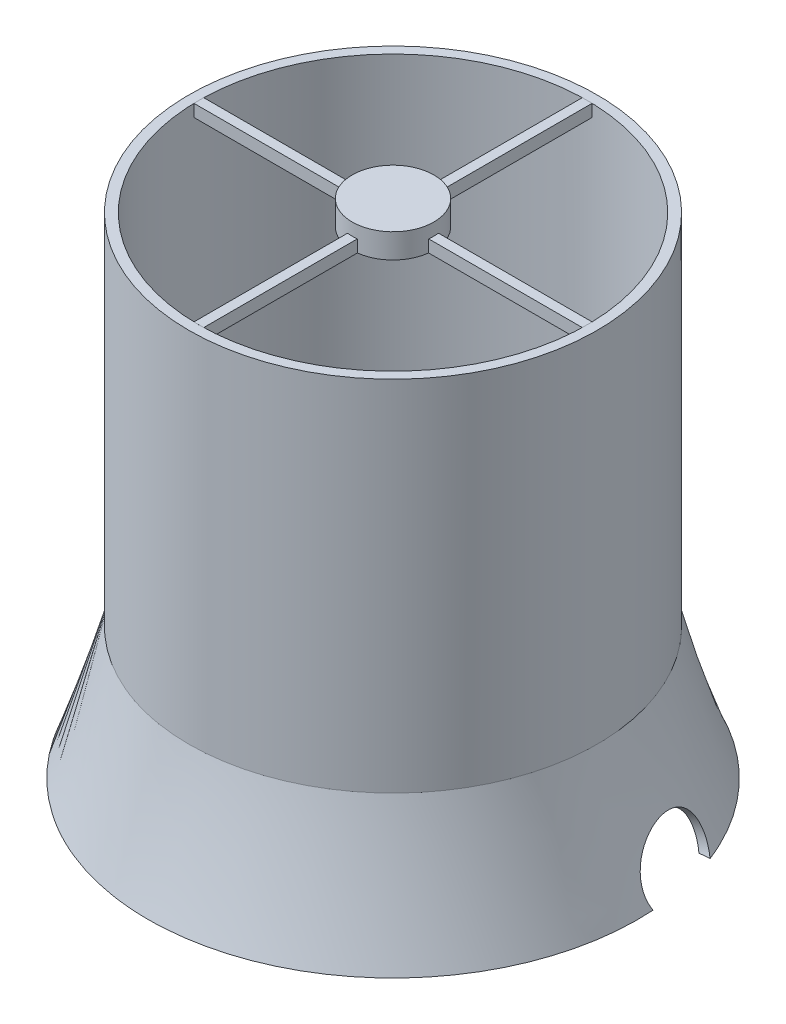
ISO-10303-21;
HEADER;
FILE_DESCRIPTION(('STEP AP214'),'2;1');
FILE_NAME('part.step','',(''),(''),'','','');
FILE_SCHEMA(('AUTOMOTIVE_DESIGN { 1 0 10303 214 1 1 1 1 }'));
ENDSEC;
DATA;
#1=APPLICATION_CONTEXT('core data for automotive mechanical design processes');
#2=APPLICATION_PROTOCOL_DEFINITION('international standard','automotive_design',2000,#1);
#3=PRODUCT_CONTEXT('',#1,'mechanical');
#4=PRODUCT('Part','Part','',(#3));
#5=PRODUCT_RELATED_PRODUCT_CATEGORY('part','',(#4));
#6=PRODUCT_DEFINITION_FORMATION('','',#4);
#7=PRODUCT_DEFINITION_CONTEXT('part definition',#1,'design');
#8=PRODUCT_DEFINITION('design','',#6,#7);
#9=PRODUCT_DEFINITION_SHAPE('','',#8);
#10=(LENGTH_UNIT() NAMED_UNIT(*) SI_UNIT(.MILLI.,.METRE.));
#11=(NAMED_UNIT(*) PLANE_ANGLE_UNIT() SI_UNIT($,.RADIAN.));
#12=(NAMED_UNIT(*) SI_UNIT($,.STERADIAN.) SOLID_ANGLE_UNIT());
#13=UNCERTAINTY_MEASURE_WITH_UNIT(LENGTH_MEASURE(1.E-05),#10,'distance_accuracy_value','');
#14=(GEOMETRIC_REPRESENTATION_CONTEXT(3) GLOBAL_UNCERTAINTY_ASSIGNED_CONTEXT((#13)) GLOBAL_UNIT_ASSIGNED_CONTEXT((#10,
#11,#12)) REPRESENTATION_CONTEXT('',''));
#15=CARTESIAN_POINT('',(0.,0.,0.));
#16=DIRECTION('',(0.,0.,1.));
#17=DIRECTION('',(1.,0.,0.));
#18=AXIS2_PLACEMENT_3D('',#15,#16,#17);
#19=CARTESIAN_POINT('',(0.,60.,0.));
#20=DIRECTION('',(0.,1.,0.));
#21=DIRECTION('',(0.,0.,1.));
#22=AXIS2_PLACEMENT_3D('',#19,#20,#21);
#23=PLANE('',#22);
#24=CARTESIAN_POINT('',(0.,60.,0.));
#25=DIRECTION('',(0.,1.,0.));
#26=DIRECTION('',(0.,0.,1.));
#27=AXIS2_PLACEMENT_3D('',#24,#25,#26);
#28=CIRCLE('',#27,5.);
#29=CARTESIAN_POINT('',(4.96386945839634,60.,0.6));
#30=VERTEX_POINT('',#29);
#31=CARTESIAN_POINT('',(4.96386945839634,60.,-0.6));
#32=VERTEX_POINT('',#31);
#33=EDGE_CURVE('E13',#30,#32,#28,.T.);
#34=ORIENTED_EDGE('',*,*,#33,.F.);
#35=DIRECTION('',(1.,0.,0.));
#36=VECTOR('',#35,1.);
#37=CARTESIAN_POINT('',(4.96386945839634,60.,0.6));
#38=LINE('',#37,#36);
#39=CARTESIAN_POINT('',(23.7924357727409,60.,0.6));
#40=VERTEX_POINT('',#39);
#41=EDGE_CURVE('E219',#30,#40,#38,.T.);
#42=ORIENTED_EDGE('',*,*,#41,.T.);
#43=DIRECTION('',(0.,0.,-1.));
#44=VECTOR('',#43,1.);
#45=CARTESIAN_POINT('',(23.7924357727409,60.,0.6));
#46=LINE('',#45,#44);
#47=CARTESIAN_POINT('',(23.7924357727409,60.,-0.6));
#48=VERTEX_POINT('',#47);
#49=EDGE_CURVE('E222',#40,#48,#46,.T.);
#50=ORIENTED_EDGE('',*,*,#49,.T.);
#51=DIRECTION('',(-1.,0.,0.));
#52=VECTOR('',#51,1.);
#53=CARTESIAN_POINT('',(23.7924357727409,60.,-0.6));
#54=LINE('',#53,#52);
#55=EDGE_CURVE('E225',#48,#32,#54,.T.);
#56=ORIENTED_EDGE('',*,*,#55,.T.);
#57=EDGE_LOOP('',(#34,#42,#50,#56));
#58=FACE_BOUND('',#57,.T.);
#59=ADVANCED_FACE('F49',(#58),#23,.T.);
#60=CARTESIAN_POINT('',(0.6,60.,-4.96386945839634));
#61=VERTEX_POINT('',#60);
#62=CARTESIAN_POINT('',(-0.6,60.,-4.96386945839634));
#63=VERTEX_POINT('',#62);
#64=EDGE_CURVE('E59',#61,#63,#28,.T.);
#65=ORIENTED_EDGE('',*,*,#64,.F.);
#66=DIRECTION('',(0.,0.,-1.));
#67=VECTOR('',#66,1.);
#68=CARTESIAN_POINT('',(0.6,60.,-4.96386945839634));
#69=LINE('',#68,#67);
#70=CARTESIAN_POINT('',(0.6,60.,-23.7924357727409));
#71=VERTEX_POINT('',#70);
#72=EDGE_CURVE('E228',#61,#71,#69,.T.);
#73=ORIENTED_EDGE('',*,*,#72,.T.);
#74=DIRECTION('',(-1.,0.,0.));
#75=VECTOR('',#74,1.);
#76=CARTESIAN_POINT('',(0.6,60.,-23.7924357727409));
#77=LINE('',#76,#75);
#78=CARTESIAN_POINT('',(-0.6,60.,-23.7924357727409));
#79=VERTEX_POINT('',#78);
#80=EDGE_CURVE('E231',#71,#79,#77,.T.);
#81=ORIENTED_EDGE('',*,*,#80,.T.);
#82=DIRECTION('',(0.,0.,1.));
#83=VECTOR('',#82,1.);
#84=CARTESIAN_POINT('',(-0.6,60.,-23.7924357727409));
#85=LINE('',#84,#83);
#86=EDGE_CURVE('E234',#79,#63,#85,.T.);
#87=ORIENTED_EDGE('',*,*,#86,.T.);
#88=EDGE_LOOP('',(#65,#73,#81,#87));
#89=FACE_BOUND('',#88,.T.);
#90=ADVANCED_FACE('F348',(#89),#23,.T.);
#91=CARTESIAN_POINT('',(-4.96386945839634,60.,-0.600000000000001));
#92=VERTEX_POINT('',#91);
#93=CARTESIAN_POINT('',(-4.96386945839634,60.,0.6));
#94=VERTEX_POINT('',#93);
#95=EDGE_CURVE('E121',#92,#94,#28,.T.);
#96=ORIENTED_EDGE('',*,*,#95,.F.);
#97=DIRECTION('',(-1.,0.,0.));
#98=VECTOR('',#97,1.);
#99=CARTESIAN_POINT('',(-4.96386945839634,60.,-0.6));
#100=LINE('',#99,#98);
#101=CARTESIAN_POINT('',(-23.7924357727409,60.,-0.6));
#102=VERTEX_POINT('',#101);
#103=EDGE_CURVE('E236',#92,#102,#100,.T.);
#104=ORIENTED_EDGE('',*,*,#103,.T.);
#105=DIRECTION('',(0.,0.,1.));
#106=VECTOR('',#105,1.);
#107=CARTESIAN_POINT('',(-23.7924357727409,60.,-0.6));
#108=LINE('',#107,#106);
#109=CARTESIAN_POINT('',(-23.7924357727409,60.,0.6));
#110=VERTEX_POINT('',#109);
#111=EDGE_CURVE('E204',#102,#110,#108,.T.);
#112=ORIENTED_EDGE('',*,*,#111,.T.);
#113=DIRECTION('',(1.,0.,0.));
#114=VECTOR('',#113,1.);
#115=CARTESIAN_POINT('',(-23.7924357727409,60.,0.6));
#116=LINE('',#115,#114);
#117=EDGE_CURVE('E207',#110,#94,#116,.T.);
#118=ORIENTED_EDGE('',*,*,#117,.T.);
#119=EDGE_LOOP('',(#96,#104,#112,#118));
#120=FACE_BOUND('',#119,.T.);
#121=ADVANCED_FACE('F266',(#120),#23,.T.);
#122=CARTESIAN_POINT('',(-23.7924357727409,58.5,-0.6));
#123=DIRECTION('',(-1.,0.,0.));
#124=DIRECTION('',(0.,0.,1.));
#125=AXIS2_PLACEMENT_3D('',#122,#123,#124);
#126=PLANE('',#125);
#127=ORIENTED_EDGE('',*,*,#111,.F.);
#128=DIRECTION('',(0.,1.,0.));
#129=VECTOR('',#128,1.);
#130=CARTESIAN_POINT('',(-23.7924357727409,58.5,-0.6));
#131=LINE('',#130,#129);
#132=CARTESIAN_POINT('',(-23.7924357727409,58.5,-0.6));
#133=VERTEX_POINT('',#132);
#134=EDGE_CURVE('E69',#133,#102,#131,.T.);
#135=ORIENTED_EDGE('',*,*,#134,.F.);
#136=DIRECTION('',(0.,0.,1.));
#137=VECTOR('',#136,1.);
#138=CARTESIAN_POINT('',(-23.7924357727409,58.5,-0.6));
#139=LINE('',#138,#137);
#140=CARTESIAN_POINT('',(-23.7924357727409,58.5,0.6));
#141=VERTEX_POINT('',#140);
#142=EDGE_CURVE('E238',#133,#141,#139,.T.);
#143=ORIENTED_EDGE('',*,*,#142,.T.);
#144=DIRECTION('',(0.,1.,0.));
#145=VECTOR('',#144,1.);
#146=CARTESIAN_POINT('',(-23.7924357727409,58.5,0.6));
#147=LINE('',#146,#145);
#148=EDGE_CURVE('E53',#141,#110,#147,.T.);
#149=ORIENTED_EDGE('',*,*,#148,.T.);
#150=EDGE_LOOP('',(#127,#135,#143,#149));
#151=FACE_BOUND('',#150,.T.);
#152=ADVANCED_FACE('F51',(#151),#126,.T.);
#153=CARTESIAN_POINT('',(-4.96386945839634,58.5,-0.6));
#154=DIRECTION('',(0.,0.,-1.));
#155=DIRECTION('',(-1.,0.,0.));
#156=AXIS2_PLACEMENT_3D('',#153,#154,#155);
#157=PLANE('',#156);
#158=ORIENTED_EDGE('',*,*,#103,.F.);
#159=DIRECTION('',(0.,1.,0.));
#160=VECTOR('',#159,1.);
#161=CARTESIAN_POINT('',(-4.96386945839634,58.5,-0.600000000000001));
#162=LINE('',#161,#160);
#163=CARTESIAN_POINT('',(-4.96386945839634,58.5,-0.600000000000001));
#164=VERTEX_POINT('',#163);
#165=EDGE_CURVE('E185',#164,#92,#162,.T.);
#166=ORIENTED_EDGE('',*,*,#165,.F.);
#167=DIRECTION('',(-1.,0.,0.));
#168=VECTOR('',#167,1.);
#169=CARTESIAN_POINT('',(-4.96386945839634,58.5,-0.6));
#170=LINE('',#169,#168);
#171=EDGE_CURVE('E194',#164,#133,#170,.T.);
#172=ORIENTED_EDGE('',*,*,#171,.T.);
#173=ORIENTED_EDGE('',*,*,#134,.T.);
#174=EDGE_LOOP('',(#158,#166,#172,#173));
#175=FACE_BOUND('',#174,.T.);
#176=ADVANCED_FACE('F267',(#175),#157,.T.);
#177=CARTESIAN_POINT('',(0.,58.5,0.));
#178=DIRECTION('',(0.,1.,0.));
#179=DIRECTION('',(0.,0.,1.));
#180=AXIS2_PLACEMENT_3D('',#177,#178,#179);
#181=CYLINDRICAL_SURFACE('',#180,5.);
#182=ORIENTED_EDGE('',*,*,#165,.T.);
#183=ORIENTED_EDGE('',*,*,#95,.T.);
#184=DIRECTION('',(0.,1.,0.));
#185=VECTOR('',#184,1.);
#186=CARTESIAN_POINT('',(-4.96386945839634,58.5,0.6));
#187=LINE('',#186,#185);
#188=CARTESIAN_POINT('',(-4.96386945839634,58.5,0.6));
#189=VERTEX_POINT('',#188);
#190=EDGE_CURVE('E264',#189,#94,#187,.T.);
#191=ORIENTED_EDGE('',*,*,#190,.F.);
#192=CARTESIAN_POINT('',(0.,58.5,0.));
#193=DIRECTION('',(0.,1.,0.));
#194=DIRECTION('',(0.,0.,1.));
#195=AXIS2_PLACEMENT_3D('',#192,#193,#194);
#196=CIRCLE('',#195,5.);
#197=CARTESIAN_POINT('',(-0.600000000000001,58.5,4.96386945839634));
#198=VERTEX_POINT('',#197);
#199=EDGE_CURVE('E276',#189,#198,#196,.T.);
#200=ORIENTED_EDGE('',*,*,#199,.T.);
#201=DIRECTION('',(0.,1.,0.));
#202=VECTOR('',#201,1.);
#203=CARTESIAN_POINT('',(-0.600000000000001,58.5,4.96386945839634));
#204=LINE('',#203,#202);
#205=CARTESIAN_POINT('',(-0.600000000000001,60.,4.96386945839634));
#206=VERTEX_POINT('',#205);
#207=EDGE_CURVE('E262',#198,#206,#204,.T.);
#208=ORIENTED_EDGE('',*,*,#207,.T.);
#209=CARTESIAN_POINT('',(0.6,60.,4.96386945839634));
#210=VERTEX_POINT('',#209);
#211=EDGE_CURVE('E61',#206,#210,#28,.T.);
#212=ORIENTED_EDGE('',*,*,#211,.T.);
#213=DIRECTION('',(0.,1.,0.));
#214=VECTOR('',#213,1.);
#215=CARTESIAN_POINT('',(0.6,58.5,4.96386945839634));
#216=LINE('',#215,#214);
#217=CARTESIAN_POINT('',(0.6,58.5,4.96386945839634));
#218=VERTEX_POINT('',#217);
#219=EDGE_CURVE('E255',#218,#210,#216,.T.);
#220=ORIENTED_EDGE('',*,*,#219,.F.);
#221=CARTESIAN_POINT('',(0.,58.5,0.));
#222=DIRECTION('',(0.,1.,0.));
#223=DIRECTION('',(0.,0.,1.));
#224=AXIS2_PLACEMENT_3D('',#221,#222,#223);
#225=CIRCLE('',#224,5.);
#226=CARTESIAN_POINT('',(4.96386945839634,58.5,0.6));
#227=VERTEX_POINT('',#226);
#228=EDGE_CURVE('E287',#218,#227,#225,.T.);
#229=ORIENTED_EDGE('',*,*,#228,.T.);
#230=DIRECTION('',(0.,1.,0.));
#231=VECTOR('',#230,1.);
#232=CARTESIAN_POINT('',(4.96386945839634,58.5,0.6));
#233=LINE('',#232,#231);
#234=EDGE_CURVE('E252',#227,#30,#233,.T.);
#235=ORIENTED_EDGE('',*,*,#234,.T.);
#236=ORIENTED_EDGE('',*,*,#33,.T.);
#237=DIRECTION('',(0.,1.,0.));
#238=VECTOR('',#237,1.);
#239=CARTESIAN_POINT('',(4.96386945839634,58.5,-0.6));
#240=LINE('',#239,#238);
#241=CARTESIAN_POINT('',(4.96386945839634,58.5,-0.6));
#242=VERTEX_POINT('',#241);
#243=EDGE_CURVE('E246',#242,#32,#240,.T.);
#244=ORIENTED_EDGE('',*,*,#243,.F.);
#245=CARTESIAN_POINT('',(0.,58.5,0.));
#246=DIRECTION('',(0.,1.,0.));
#247=DIRECTION('',(0.,0.,1.));
#248=AXIS2_PLACEMENT_3D('',#245,#246,#247);
#249=CIRCLE('',#248,5.);
#250=CARTESIAN_POINT('',(0.6,58.5,-4.96386945839634));
#251=VERTEX_POINT('',#250);
#252=EDGE_CURVE('E299',#242,#251,#249,.T.);
#253=ORIENTED_EDGE('',*,*,#252,.T.);
#254=DIRECTION('',(0.,1.,0.));
#255=VECTOR('',#254,1.);
#256=CARTESIAN_POINT('',(0.6,58.5,-4.96386945839634));
#257=LINE('',#256,#255);
#258=EDGE_CURVE('E244',#251,#61,#257,.T.);
#259=ORIENTED_EDGE('',*,*,#258,.T.);
#260=ORIENTED_EDGE('',*,*,#64,.T.);
#261=DIRECTION('',(0.,1.,0.));
#262=VECTOR('',#261,1.);
#263=CARTESIAN_POINT('',(-0.6,58.5,-4.96386945839634));
#264=LINE('',#263,#262);
#265=CARTESIAN_POINT('',(-0.6,58.5,-4.96386945839634));
#266=VERTEX_POINT('',#265);
#267=EDGE_CURVE('E174',#266,#63,#264,.T.);
#268=ORIENTED_EDGE('',*,*,#267,.F.);
#269=CARTESIAN_POINT('',(0.,58.5,0.));
#270=DIRECTION('',(0.,1.,0.));
#271=DIRECTION('',(0.,0.,1.));
#272=AXIS2_PLACEMENT_3D('',#269,#270,#271);
#273=CIRCLE('',#272,5.);
#274=EDGE_CURVE('E178',#266,#164,#273,.T.);
#275=ORIENTED_EDGE('',*,*,#274,.T.);
#276=EDGE_LOOP('',(#182,#183,#191,#200,#208,#212,#220,#229,#235,#236,#244,#253,#259,#260,#268,#275));
#277=FACE_BOUND('',#276,.T.);
#278=CARTESIAN_POINT('',(0.,61.5,0.));
#279=DIRECTION('',(0.,1.,0.));
#280=DIRECTION('',(0.,0.,1.));
#281=AXIS2_PLACEMENT_3D('',#278,#279,#280);
#282=CIRCLE('',#281,5.);
#283=CARTESIAN_POINT('',(0.,61.5,5.));
#284=VERTEX_POINT('',#283);
#285=EDGE_CURVE('E208',#284,#284,#282,.T.);
#286=ORIENTED_EDGE('',*,*,#285,.F.);
#287=EDGE_LOOP('',(#286));
#288=FACE_BOUND('',#287,.T.);
#289=ADVANCED_FACE('F176',(#277,#288),#181,.T.);
#290=CARTESIAN_POINT('',(-0.6,58.5,-23.7924357727409));
#291=DIRECTION('',(-1.,0.,0.));
#292=DIRECTION('',(0.,0.,1.));
#293=AXIS2_PLACEMENT_3D('',#290,#291,#292);
#294=PLANE('',#293);
#295=ORIENTED_EDGE('',*,*,#86,.F.);
#296=DIRECTION('',(0.,1.,0.));
#297=VECTOR('',#296,1.);
#298=CARTESIAN_POINT('',(-0.6,58.5,-23.7924357727409));
#299=LINE('',#298,#297);
#300=CARTESIAN_POINT('',(-0.6,58.5,-23.7924357727409));
#301=VERTEX_POINT('',#300);
#302=EDGE_CURVE('E186',#301,#79,#299,.T.);
#303=ORIENTED_EDGE('',*,*,#302,.F.);
#304=DIRECTION('',(0.,0.,1.));
#305=VECTOR('',#304,1.);
#306=CARTESIAN_POINT('',(-0.6,58.5,-23.7924357727409));
#307=LINE('',#306,#305);
#308=EDGE_CURVE('E192',#301,#266,#307,.T.);
#309=ORIENTED_EDGE('',*,*,#308,.T.);
#310=ORIENTED_EDGE('',*,*,#267,.T.);
#311=EDGE_LOOP('',(#295,#303,#309,#310));
#312=FACE_BOUND('',#311,.T.);
#313=ADVANCED_FACE('F196',(#312),#294,.T.);
#314=CARTESIAN_POINT('',(0.6,58.5,-23.7924357727409));
#315=DIRECTION('',(0.,0.,-1.));
#316=DIRECTION('',(-1.,0.,0.));
#317=AXIS2_PLACEMENT_3D('',#314,#315,#316);
#318=PLANE('',#317);
#319=ORIENTED_EDGE('',*,*,#80,.F.);
#320=DIRECTION('',(0.,1.,0.));
#321=VECTOR('',#320,1.);
#322=CARTESIAN_POINT('',(0.6,58.5,-23.7924357727409));
#323=LINE('',#322,#321);
#324=CARTESIAN_POINT('',(0.6,58.5,-23.7924357727409));
#325=VERTEX_POINT('',#324);
#326=EDGE_CURVE('E242',#325,#71,#323,.T.);
#327=ORIENTED_EDGE('',*,*,#326,.F.);
#328=DIRECTION('',(-1.,0.,0.));
#329=VECTOR('',#328,1.);
#330=CARTESIAN_POINT('',(0.6,58.5,-23.7924357727409));
#331=LINE('',#330,#329);
#332=EDGE_CURVE('E197',#325,#301,#331,.T.);
#333=ORIENTED_EDGE('',*,*,#332,.T.);
#334=ORIENTED_EDGE('',*,*,#302,.T.);
#335=EDGE_LOOP('',(#319,#327,#333,#334));
#336=FACE_BOUND('',#335,.T.);
#337=ADVANCED_FACE('F358',(#336),#318,.T.);
#338=CARTESIAN_POINT('',(0.6,58.5,-4.96386945839634));
#339=DIRECTION('',(1.,0.,0.));
#340=DIRECTION('',(0.,0.,-1.));
#341=AXIS2_PLACEMENT_3D('',#338,#339,#340);
#342=PLANE('',#341);
#343=ORIENTED_EDGE('',*,*,#72,.F.);
#344=ORIENTED_EDGE('',*,*,#258,.F.);
#345=DIRECTION('',(0.,0.,-1.));
#346=VECTOR('',#345,1.);
#347=CARTESIAN_POINT('',(0.6,58.5,-4.96386945839634));
#348=LINE('',#347,#346);
#349=EDGE_CURVE('E199',#251,#325,#348,.T.);
#350=ORIENTED_EDGE('',*,*,#349,.T.);
#351=ORIENTED_EDGE('',*,*,#326,.T.);
#352=EDGE_LOOP('',(#343,#344,#350,#351));
#353=FACE_BOUND('',#352,.T.);
#354=ADVANCED_FACE('F305',(#353),#342,.T.);
#355=CARTESIAN_POINT('',(23.7924357727409,58.5,-0.6));
#356=DIRECTION('',(0.,0.,-1.));
#357=DIRECTION('',(-1.,0.,0.));
#358=AXIS2_PLACEMENT_3D('',#355,#356,#357);
#359=PLANE('',#358);
#360=ORIENTED_EDGE('',*,*,#55,.F.);
#361=DIRECTION('',(0.,1.,0.));
#362=VECTOR('',#361,1.);
#363=CARTESIAN_POINT('',(23.7924357727409,58.5,-0.6));
#364=LINE('',#363,#362);
#365=CARTESIAN_POINT('',(23.7924357727409,58.5,-0.6));
#366=VERTEX_POINT('',#365);
#367=EDGE_CURVE('E248',#366,#48,#364,.T.);
#368=ORIENTED_EDGE('',*,*,#367,.F.);
#369=DIRECTION('',(-1.,0.,0.));
#370=VECTOR('',#369,1.);
#371=CARTESIAN_POINT('',(23.7924357727409,58.5,-0.6));
#372=LINE('',#371,#370);
#373=EDGE_CURVE('E296',#366,#242,#372,.T.);
#374=ORIENTED_EDGE('',*,*,#373,.T.);
#375=ORIENTED_EDGE('',*,*,#243,.T.);
#376=EDGE_LOOP('',(#360,#368,#374,#375));
#377=FACE_BOUND('',#376,.T.);
#378=ADVANCED_FACE('F311',(#377),#359,.T.);
#379=CARTESIAN_POINT('',(23.7924357727409,58.5,0.6));
#380=DIRECTION('',(1.,0.,0.));
#381=DIRECTION('',(0.,0.,-1.));
#382=AXIS2_PLACEMENT_3D('',#379,#380,#381);
#383=PLANE('',#382);
#384=ORIENTED_EDGE('',*,*,#49,.F.);
#385=DIRECTION('',(0.,1.,0.));
#386=VECTOR('',#385,1.);
#387=CARTESIAN_POINT('',(23.7924357727409,58.5,0.6));
#388=LINE('',#387,#386);
#389=CARTESIAN_POINT('',(23.7924357727409,58.5,0.6));
#390=VERTEX_POINT('',#389);
#391=EDGE_CURVE('E250',#390,#40,#388,.T.);
#392=ORIENTED_EDGE('',*,*,#391,.F.);
#393=DIRECTION('',(0.,0.,-1.));
#394=VECTOR('',#393,1.);
#395=CARTESIAN_POINT('',(23.7924357727409,58.5,0.6));
#396=LINE('',#395,#394);
#397=EDGE_CURVE('E293',#390,#366,#396,.T.);
#398=ORIENTED_EDGE('',*,*,#397,.T.);
#399=ORIENTED_EDGE('',*,*,#367,.T.);
#400=EDGE_LOOP('',(#384,#392,#398,#399));
#401=FACE_BOUND('',#400,.T.);
#402=ADVANCED_FACE('F316',(#401),#383,.T.);
#403=CARTESIAN_POINT('',(4.96386945839634,58.5,0.6));
#404=DIRECTION('',(0.,0.,1.));
#405=DIRECTION('',(1.,0.,0.));
#406=AXIS2_PLACEMENT_3D('',#403,#404,#405);
#407=PLANE('',#406);
#408=ORIENTED_EDGE('',*,*,#41,.F.);
#409=ORIENTED_EDGE('',*,*,#234,.F.);
#410=DIRECTION('',(1.,0.,0.));
#411=VECTOR('',#410,1.);
#412=CARTESIAN_POINT('',(4.96386945839634,58.5,0.6));
#413=LINE('',#412,#411);
#414=EDGE_CURVE('E290',#227,#390,#413,.T.);
#415=ORIENTED_EDGE('',*,*,#414,.T.);
#416=ORIENTED_EDGE('',*,*,#391,.T.);
#417=EDGE_LOOP('',(#408,#409,#415,#416));
#418=FACE_BOUND('',#417,.T.);
#419=ADVANCED_FACE('F321',(#418),#407,.T.);
#420=CARTESIAN_POINT('',(0.6,58.5,23.7924357727409));
#421=DIRECTION('',(1.,0.,0.));
#422=DIRECTION('',(0.,0.,-1.));
#423=AXIS2_PLACEMENT_3D('',#420,#421,#422);
#424=PLANE('',#423);
#425=DIRECTION('',(0.,0.,-1.));
#426=VECTOR('',#425,1.);
#427=CARTESIAN_POINT('',(0.6,60.,23.7924357727409));
#428=LINE('',#427,#426);
#429=CARTESIAN_POINT('',(0.6,60.,23.7924357727409));
#430=VERTEX_POINT('',#429);
#431=EDGE_CURVE('E216',#430,#210,#428,.T.);
#432=ORIENTED_EDGE('',*,*,#431,.F.);
#433=DIRECTION('',(0.,1.,0.));
#434=VECTOR('',#433,1.);
#435=CARTESIAN_POINT('',(0.6,58.5,23.7924357727409));
#436=LINE('',#435,#434);
#437=CARTESIAN_POINT('',(0.6,58.5,23.7924357727409));
#438=VERTEX_POINT('',#437);
#439=EDGE_CURVE('E258',#438,#430,#436,.T.);
#440=ORIENTED_EDGE('',*,*,#439,.F.);
#441=DIRECTION('',(0.,0.,-1.));
#442=VECTOR('',#441,1.);
#443=CARTESIAN_POINT('',(0.6,58.5,23.7924357727409));
#444=LINE('',#443,#442);
#445=EDGE_CURVE('E284',#438,#218,#444,.T.);
#446=ORIENTED_EDGE('',*,*,#445,.T.);
#447=ORIENTED_EDGE('',*,*,#219,.T.);
#448=EDGE_LOOP('',(#432,#440,#446,#447));
#449=FACE_BOUND('',#448,.T.);
#450=ADVANCED_FACE('F326',(#449),#424,.T.);
#451=CARTESIAN_POINT('',(-0.6,58.5,23.7924357727409));
#452=DIRECTION('',(0.,0.,1.));
#453=DIRECTION('',(1.,0.,0.));
#454=AXIS2_PLACEMENT_3D('',#451,#452,#453);
#455=PLANE('',#454);
#456=DIRECTION('',(1.,0.,0.));
#457=VECTOR('',#456,1.);
#458=CARTESIAN_POINT('',(-0.6,60.,23.7924357727409));
#459=LINE('',#458,#457);
#460=CARTESIAN_POINT('',(-0.6,60.,23.7924357727409));
#461=VERTEX_POINT('',#460);
#462=EDGE_CURVE('E213',#461,#430,#459,.T.);
#463=ORIENTED_EDGE('',*,*,#462,.F.);
#464=DIRECTION('',(0.,1.,0.));
#465=VECTOR('',#464,1.);
#466=CARTESIAN_POINT('',(-0.6,58.5,23.7924357727409));
#467=LINE('',#466,#465);
#468=CARTESIAN_POINT('',(-0.6,58.5,23.7924357727409));
#469=VERTEX_POINT('',#468);
#470=EDGE_CURVE('E260',#469,#461,#467,.T.);
#471=ORIENTED_EDGE('',*,*,#470,.F.);
#472=DIRECTION('',(1.,0.,0.));
#473=VECTOR('',#472,1.);
#474=CARTESIAN_POINT('',(-0.6,58.5,23.7924357727409));
#475=LINE('',#474,#473);
#476=EDGE_CURVE('E281',#469,#438,#475,.T.);
#477=ORIENTED_EDGE('',*,*,#476,.T.);
#478=ORIENTED_EDGE('',*,*,#439,.T.);
#479=EDGE_LOOP('',(#463,#471,#477,#478));
#480=FACE_BOUND('',#479,.T.);
#481=ADVANCED_FACE('F329',(#480),#455,.T.);
#482=CARTESIAN_POINT('',(-0.6,58.5,4.96386945839634));
#483=DIRECTION('',(-1.,0.,0.));
#484=DIRECTION('',(0.,0.,1.));
#485=AXIS2_PLACEMENT_3D('',#482,#483,#484);
#486=PLANE('',#485);
#487=DIRECTION('',(0.,0.,1.));
#488=VECTOR('',#487,1.);
#489=CARTESIAN_POINT('',(-0.6,60.,4.96386945839634));
#490=LINE('',#489,#488);
#491=EDGE_CURVE('E210',#206,#461,#490,.T.);
#492=ORIENTED_EDGE('',*,*,#491,.F.);
#493=ORIENTED_EDGE('',*,*,#207,.F.);
#494=DIRECTION('',(0.,0.,1.));
#495=VECTOR('',#494,1.);
#496=CARTESIAN_POINT('',(-0.6,58.5,4.96386945839634));
#497=LINE('',#496,#495);
#498=EDGE_CURVE('E278',#198,#469,#497,.T.);
#499=ORIENTED_EDGE('',*,*,#498,.T.);
#500=ORIENTED_EDGE('',*,*,#470,.T.);
#501=EDGE_LOOP('',(#492,#493,#499,#500));
#502=FACE_BOUND('',#501,.T.);
#503=ADVANCED_FACE('F333',(#502),#486,.T.);
#504=CARTESIAN_POINT('',(-23.7924357727409,58.5,0.6));
#505=DIRECTION('',(0.,0.,1.));
#506=DIRECTION('',(1.,0.,0.));
#507=AXIS2_PLACEMENT_3D('',#504,#505,#506);
#508=PLANE('',#507);
#509=ORIENTED_EDGE('',*,*,#117,.F.);
#510=ORIENTED_EDGE('',*,*,#148,.F.);
#511=DIRECTION('',(1.,0.,0.));
#512=VECTOR('',#511,1.);
#513=CARTESIAN_POINT('',(-23.7924357727409,58.5,0.6));
#514=LINE('',#513,#512);
#515=EDGE_CURVE('E274',#141,#189,#514,.T.);
#516=ORIENTED_EDGE('',*,*,#515,.T.);
#517=ORIENTED_EDGE('',*,*,#190,.T.);
#518=EDGE_LOOP('',(#509,#510,#516,#517));
#519=FACE_BOUND('',#518,.T.);
#520=ADVANCED_FACE('F265',(#519),#508,.T.);
#521=CARTESIAN_POINT('',(0.,58.5,0.));
#522=DIRECTION('',(0.,1.,0.));
#523=DIRECTION('',(0.,0.,1.));
#524=AXIS2_PLACEMENT_3D('',#521,#522,#523);
#525=PLANE('',#524);
#526=ORIENTED_EDGE('',*,*,#142,.F.);
#527=ORIENTED_EDGE('',*,*,#171,.F.);
#528=ORIENTED_EDGE('',*,*,#274,.F.);
#529=ORIENTED_EDGE('',*,*,#308,.F.);
#530=ORIENTED_EDGE('',*,*,#332,.F.);
#531=ORIENTED_EDGE('',*,*,#349,.F.);
#532=ORIENTED_EDGE('',*,*,#252,.F.);
#533=ORIENTED_EDGE('',*,*,#373,.F.);
#534=ORIENTED_EDGE('',*,*,#397,.F.);
#535=ORIENTED_EDGE('',*,*,#414,.F.);
#536=ORIENTED_EDGE('',*,*,#228,.F.);
#537=ORIENTED_EDGE('',*,*,#445,.F.);
#538=ORIENTED_EDGE('',*,*,#476,.F.);
#539=ORIENTED_EDGE('',*,*,#498,.F.);
#540=ORIENTED_EDGE('',*,*,#199,.F.);
#541=ORIENTED_EDGE('',*,*,#515,.F.);
#542=EDGE_LOOP('',(#526,#527,#528,#529,#530,#531,#532,#533,#534,#535,#536,#537,#538,#539,#540,#541));
#543=FACE_BOUND('',#542,.T.);
#544=ADVANCED_FACE('F190',(#543),#525,.F.);
#545=ORIENTED_EDGE('',*,*,#211,.F.);
#546=ORIENTED_EDGE('',*,*,#491,.T.);
#547=ORIENTED_EDGE('',*,*,#462,.T.);
#548=ORIENTED_EDGE('',*,*,#431,.T.);
#549=EDGE_LOOP('',(#545,#546,#547,#548));
#550=FACE_BOUND('',#549,.T.);
#551=ADVANCED_FACE('F335',(#550),#23,.T.);
#552=CARTESIAN_POINT('',(0.,61.5,0.));
#553=DIRECTION('',(0.,1.,0.));
#554=DIRECTION('',(0.,0.,1.));
#555=AXIS2_PLACEMENT_3D('',#552,#553,#554);
#556=PLANE('',#555);
#557=ORIENTED_EDGE('',*,*,#285,.T.);
#558=EDGE_LOOP('',(#557));
#559=FACE_BOUND('',#558,.T.);
#560=ADVANCED_FACE('F337',(#559),#556,.T.);
#561=CLOSED_SHELL('',(#59,#90,#121,#152,#176,#289,#313,#337,#354,#378,#402,#419,#450,#481,#503,
#520,#544,#551,#560));
#562=MANIFOLD_SOLID_BREP('B2',#561);
#563=CARTESIAN_POINT('',(8.65892311638241,0.,-28.7232144869717));
#564=CARTESIAN_POINT('',(24.9729818910742,60.,-1.16197051084782));
#565=CARTESIAN_POINT('',(-48.7875058575609,0.,-46.0410607197365));
#566=CARTESIAN_POINT('',(22.6490408693786,60.,-51.1079342929962));
#567=CARTESIAN_POINT('',(-66.1053520903257,0.,11.4053682542068));
#568=CARTESIAN_POINT('',(-27.2969229127698,60.,-48.7839932713006));
#569=CARTESIAN_POINT('',(-8.65892311638242,0.,28.7232144869716));
#570=CARTESIAN_POINT('',(-24.9729818910742,60.,1.16197051084781));
#571=CARTESIAN_POINT('',(48.7875058575609,0.,46.0410607197365));
#572=CARTESIAN_POINT('',(-22.6490408693786,60.,51.1079342929962));
#573=CARTESIAN_POINT('',(66.1053520903257,0.,-11.4053682542068));
#574=CARTESIAN_POINT('',(27.2969229127698,60.,48.7839932713006));
#575=CARTESIAN_POINT('',(8.65892311638241,0.,-28.7232144869717));
#576=CARTESIAN_POINT('',(24.9729818910742,60.,-1.16197051084782));
#577=(BOUNDED_SURFACE() B_SPLINE_SURFACE(3,1,((#563,#564),(#565,#566),(#567,#568),(#569,#570),
(#571,#572),(#573,#574),(#575,#576)),.UNSPECIFIED.,.T.,.F.,.F.) B_SPLINE_SURFACE_WITH_KNOTS((4,
3,4),(2,2),(0.,0.5,1.),(0.,1.),
.UNSPECIFIED.) GEOMETRIC_REPRESENTATION_ITEM() RATIONAL_B_SPLINE_SURFACE(((1.,1.),
(0.333333333333334,0.333333333333334),(0.333333333333334,0.333333333333334),(1.,1.),
(0.333333333333333,0.333333333333333),(0.333333333333333,0.333333333333333),(1.,1.))) REPRESENTATION_ITEM('') SURFACE());
#578=CARTESIAN_POINT('',(27.9530597081509,0.,-10.891577156342));
#579=CARTESIAN_POINT('',(27.8912070782502,0.117001040372839,-10.9338622746227));
#580=CARTESIAN_POINT('',(27.8303649235104,0.236420496486258,-10.9709389608689));
#581=CARTESIAN_POINT('',(27.7112748254746,0.479308415385147,-11.0344901775251));
#582=CARTESIAN_POINT('',(27.653026937153,0.602776963877682,-11.0609644833579));
#583=CARTESIAN_POINT('',(27.5397341205141,0.852897764583404,-11.1031116312436));
#584=CARTESIAN_POINT('',(27.4846873566108,0.979548131404516,-11.1187907205275));
#585=CARTESIAN_POINT('',(27.3782769217773,1.23524835751727,-11.1392739734656));
#586=CARTESIAN_POINT('',(27.3269131245195,1.36429813431655,-11.1440785102953));
#587=CARTESIAN_POINT('',(27.2282924584767,1.6240010358875,-11.1427847457027));
#588=CARTESIAN_POINT('',(27.1810382994198,1.75465515468024,-11.1366793069921));
#589=CARTESIAN_POINT('',(27.091047164622,2.01661196232896,-11.1135965673044));
#590=CARTESIAN_POINT('',(27.0483118649948,2.14791487306157,-11.0966152486644));
#591=CARTESIAN_POINT('',(26.9677203622104,2.41008317363644,-11.0519190507511));
#592=CARTESIAN_POINT('',(26.929860639223,2.54094881191896,-11.0242119732855));
#593=CARTESIAN_POINT('',(26.859200421117,2.80143618177941,-10.9582516435362));
#594=CARTESIAN_POINT('',(26.8264017995357,2.93105743613453,-10.9199945003267));
#595=CARTESIAN_POINT('',(26.7661796543895,3.18740281371497,-10.8334306220897));
#596=CARTESIAN_POINT('',(26.7387296375212,3.31413832002787,-10.7851759971188));
#597=CARTESIAN_POINT('',(26.6890499841917,3.56451332813349,-10.6788113787872));
#598=CARTESIAN_POINT('',(26.6668222724833,3.68815167347279,-10.6206977653068));
#599=CARTESIAN_POINT('',(26.6275837185732,3.93138430740952,-10.4950143084045));
#600=CARTESIAN_POINT('',(26.6105729482967,4.05097854023114,-10.4274443346279));
#601=CARTESIAN_POINT('',(26.581676010824,4.28529182774503,-10.283260803272));
#602=CARTESIAN_POINT('',(26.5697917255764,4.40000907817444,-10.206643937675));
#603=CARTESIAN_POINT('',(26.5509005202221,4.62494945559557,-10.0439535740253));
#604=CARTESIAN_POINT('',(26.5439502665999,4.73510710288092,-9.95778294706525));
#605=CARTESIAN_POINT('',(26.534934239399,4.94874493158342,-9.77721458021539));
#606=CARTESIAN_POINT('',(26.5328704284755,5.05222241366464,-9.68281355033651));
#607=CARTESIAN_POINT('',(26.5333772940432,5.25158363289064,-9.48647512282047));
#608=CARTESIAN_POINT('',(26.5359440083276,5.34747378901059,-9.38454423982969));
#609=CARTESIAN_POINT('',(26.545411963285,5.5310247160344,-9.17370024892719));
#610=CARTESIAN_POINT('',(26.5523142188136,5.61868355464255,-9.06478551160881));
#611=CARTESIAN_POINT('',(26.5762221586627,5.84177807313658,-8.76421498184431));
#612=CARTESIAN_POINT('',(26.5969072980855,5.96909529579985,-8.56672452811405));
#613=CARTESIAN_POINT('',(26.6480703726186,6.19542787297785,-8.15733426945452));
#614=CARTESIAN_POINT('',(26.6785471744046,6.29444650037445,-7.94543613436161));
#615=CARTESIAN_POINT('',(26.7334154911748,6.42730899768467,-7.60069045771265));
#616=CARTESIAN_POINT('',(26.7551483821513,6.47120350249794,-7.47120489384187));
#617=CARTESIAN_POINT('',(26.8011337096624,6.5480166447093,-7.20941890783696));
#618=CARTESIAN_POINT('',(26.8253863329485,6.58093446780192,-7.07711827764122));
#619=CARTESIAN_POINT('',(26.876132323671,6.63549992652543,-6.81050991723848));
#620=CARTESIAN_POINT('',(26.9026277293495,6.65713717973101,-6.67620045465945));
#621=CARTESIAN_POINT('',(26.9575674209037,6.68889760852376,-6.40662224850792));
#622=CARTESIAN_POINT('',(26.9860116726898,6.69902098546056,-6.27135352175224));
#623=CARTESIAN_POINT('',(27.0446387947008,6.7076628921111,-6.00065990280795));
#624=CARTESIAN_POINT('',(27.0748236227928,6.70616809015034,-5.86523500955909));
#625=CARTESIAN_POINT('',(27.136680299795,6.69155849100076,-5.59540693027833));
#626=CARTESIAN_POINT('',(27.1683515913183,6.67844801695127,-5.46100338288866));
#627=CARTESIAN_POINT('',(27.2329516557896,6.64077636603602,-5.19441058187391));
#628=CARTESIAN_POINT('',(27.2658778225061,6.61623784852319,-5.0622174802899));
#629=CARTESIAN_POINT('',(27.3328979892332,6.55595352980338,-4.80077750241357));
#630=CARTESIAN_POINT('',(27.3669913000162,6.52021424460207,-4.67152895990957));
#631=CARTESIAN_POINT('',(27.4145104380272,6.46371552968356,-4.49681084076834));
#632=CARTESIAN_POINT('',(27.4274797003843,6.4476300994518,-4.44966577621955));
#633=CARTESIAN_POINT('',(27.4535641060264,6.41397252819189,-4.35595212561847));
#634=CARTESIAN_POINT('',(27.4666792444726,6.39640043635024,-4.3093835205523));
#635=CARTESIAN_POINT('',(27.5160122583137,6.3279145014752,-4.1363252417958));
#636=CARTESIAN_POINT('',(27.5527048376888,6.27220784018935,-4.0118247514892));
#637=CARTESIAN_POINT('',(27.6271307174129,6.15023506966595,-3.7683618321122));
#638=CARTESIAN_POINT('',(27.6648646409056,6.08396251927481,-3.64940283876877));
#639=CARTESIAN_POINT('',(27.7414182623883,5.94129712207682,-3.41770793642945));
#640=CARTESIAN_POINT('',(27.7802400689604,5.86488336942841,-3.30498558328476));
#641=CARTESIAN_POINT('',(27.8589026639471,5.70265712105848,-3.08682941279824));
#642=CARTESIAN_POINT('',(27.8987438426357,5.61684098301202,-2.98139844599827));
#643=CARTESIAN_POINT('',(27.9793677867122,5.43668626958126,-2.77882295056292));
#644=CARTESIAN_POINT('',(28.0201488566106,5.34236226373484,-2.68166478960518));
#645=CARTESIAN_POINT('',(28.1027350567383,5.14578171991834,-2.49612935830647));
#646=CARTESIAN_POINT('',(28.1445405592159,5.04352226829788,-2.40775534065569));
#647=CARTESIAN_POINT('',(28.2291134934346,4.83199475976691,-2.24057899987033));
#648=CARTESIAN_POINT('',(28.2718800123647,4.7227331850254,-2.16176801396594));
#649=CARTESIAN_POINT('',(28.3583968781391,4.49791553143206,-2.01421202500047));
#650=CARTESIAN_POINT('',(28.4021475797216,4.38235716090862,-1.94547072075043));
#651=CARTESIAN_POINT('',(28.4906634677682,4.14557603049785,-1.81848701148088));
#652=CARTESIAN_POINT('',(28.5354308655502,4.02434016009737,-1.76027058501495));
#653=CARTESIAN_POINT('',(28.6257916100939,3.77734702263508,-1.65500945603281));
#654=CARTESIAN_POINT('',(28.6713852590919,3.65158808380249,-1.60796893412954));
#655=CARTESIAN_POINT('',(28.7632138190419,3.39660894434595,-1.52551109172369));
#656=CARTESIAN_POINT('',(28.809448443933,3.26739026521981,-1.49008874981246));
#657=CARTESIAN_POINT('',(28.9023964181351,3.00637916303444,-1.43114318276151));
#658=CARTESIAN_POINT('',(28.9491099329261,2.87458583501225,-1.40762422264051));
#659=CARTESIAN_POINT('',(29.0420688908436,2.61139819612098,-1.37297290683065));
#660=CARTESIAN_POINT('',(29.0883113042877,2.48002579053667,-1.36166595355851));
#661=CARTESIAN_POINT('',(29.1807118068267,2.21676771755049,-1.3509391680856));
#662=CARTESIAN_POINT('',(29.2268698955999,2.08488204819728,-1.35151938112168));
#663=CARTESIAN_POINT('',(29.3187663305025,1.82156080878155,-1.36457088134971));
#664=CARTESIAN_POINT('',(29.3645047203674,1.690125192736,-1.37704091499959));
#665=CARTESIAN_POINT('',(29.4551777192005,1.42867190431288,-1.41374910392267));
#666=CARTESIAN_POINT('',(29.5001123836881,1.29865413423812,-1.43798644305939));
#667=CARTESIAN_POINT('',(29.6142701822231,0.966840642022028,-1.51531879258921));
#668=CARTESIAN_POINT('',(29.6826392206636,0.766655949361727,-1.57699213292278));
#669=CARTESIAN_POINT('',(29.7816066239893,0.473419451774262,-1.68997196666527));
#670=CARTESIAN_POINT('',(29.8139892906921,0.376874061974283,-1.73102883853942));
#671=CARTESIAN_POINT('',(29.8773777816083,0.186397374357731,-1.8197740409623));
#672=CARTESIAN_POINT('',(29.9083834207303,0.0924664285878714,-1.8674632594515));
#673=CARTESIAN_POINT('',(29.9386016050871,0.,-1.91836751741539));
#674=B_SPLINE_CURVE_WITH_KNOTS('',3,(#578,#579,#580,#581,#582,#583,#584,#585,#586,#587,#588,
#589,#590,#591,#592,#593,#594,#595,#596,#597,#598,#599,#600,#601,#602,#603,#604,#605,#606,#607,
#608,#609,#610,#611,#612,#613,#614,#615,#616,#617,#618,#619,#620,#621,#622,#623,#624,#625,#626,
#627,#628,#629,#630,#631,#632,#633,#634,#635,#636,#637,#638,#639,#640,#641,#642,#643,#644,#645,
#646,#647,#648,#649,#650,#651,#652,#653,#654,#655,#656,#657,#658,#659,#660,#661,#662,#663,#664,
#665,#666,#667,#668,#669,#670,#671,#672,#673),.UNSPECIFIED.,.F.,.F.,(4,2,2,2,2,2,2,2,2,2,2,2,2,
2,2,2,2,2,2,2,2,2,2,2,2,2,2,2,2,2,2,2,2,2,2,2,2,2,2,2,2,2,2,2,2,2,2,4),(0.,0.416687683023483,
0.833384191767585,1.24983935358147,1.66628022393341,2.08299362897331,2.49986106113144,
2.91642583620719,3.33314444874421,3.74774330228116,4.16249472308998,4.57725186175995,
4.99216112975941,5.41176167459626,5.83153072475553,6.25094076100062,6.67044900858735,
7.37565253869715,8.08077447526057,8.49566398939997,8.91058427528687,9.32588577484814,
9.7411800116871,10.1569508623169,10.5725670356629,10.987362617256,11.4019173395576,
11.556321046741,11.710719647444,12.1338859306819,12.5573111770047,12.98162327089,
13.4061003211772,13.8298637858065,14.2537835862393,14.6773164614806,15.1010045214534,
15.5257245024188,15.9506031107192,16.3752978426171,16.8001446364222,17.2188334500399,
17.6375238569865,18.0561701263441,18.4747873641028,19.133549476013,19.4627417255265,
19.7919780898961),.UNSPECIFIED.);
#675=CARTESIAN_POINT('',(27.9530620190962,0.,-10.891577333965));
#676=VERTEX_POINT('',#675);
#677=CARTESIAN_POINT('',(29.9386016050871,0.,-1.91836751741539));
#678=VERTEX_POINT('',#677);
#679=EDGE_CURVE('E528',#676,#678,#674,.T.);
#680=CARTESIAN_POINT('',(0.,0.,0.));
#681=DIRECTION('',(0.,-1.,0.));
#682=DIRECTION('',(0.,0.,-1.));
#683=AXIS2_PLACEMENT_3D('',#680,#681,#682);
#684=CIRCLE('',#683,30.);
#685=EDGE_CURVE('E549',#678,#676,#684,.T.);
#686=CARTESIAN_POINT('',(0.,16.0854665374886,0.));
#687=DIRECTION('',(0.,1.,0.));
#688=DIRECTION('',(0.,0.,1.));
#689=AXIS2_PLACEMENT_3D('',#686,#687,#688);
#690=CIRCLE('',#689,25.);
#691=CARTESIAN_POINT('',(0.,16.0854665374886,25.));
#692=VERTEX_POINT('',#691);
#693=EDGE_CURVE('E521',#692,#692,#690,.T.);
#694=ORIENTED_EDGE('',*,*,#679,.F.);
#695=ORIENTED_EDGE('',*,*,#685,.F.);
#696=EDGE_LOOP('',(#694,#695));
#697=FACE_BOUND('',#696,.T.);
#698=ORIENTED_EDGE('',*,*,#693,.F.);
#699=EDGE_LOOP('',(#698));
#700=FACE_BOUND('',#699,.T.);
#701=ADVANCED_FACE('F506',(#697,#700),#577,.T.);
#702=CARTESIAN_POINT('',(0.,16.5,0.));
#703=DIRECTION('',(0.,1.,0.));
#704=DIRECTION('',(0.,0.,1.));
#705=AXIS2_PLACEMENT_3D('',#702,#703,#704);
#706=CYLINDRICAL_SURFACE('',#705,23.8);
#707=CARTESIAN_POINT('',(0.,60.,0.));
#708=DIRECTION('',(0.,1.,0.));
#709=DIRECTION('',(0.,0.,1.));
#710=AXIS2_PLACEMENT_3D('',#707,#708,#709);
#711=CIRCLE('',#710,23.8);
#712=CARTESIAN_POINT('',(0.,60.,23.8));
#713=VERTEX_POINT('',#712);
#714=EDGE_CURVE('E555',#713,#713,#711,.T.);
#715=ORIENTED_EDGE('',*,*,#714,.T.);
#716=EDGE_LOOP('',(#715));
#717=FACE_BOUND('',#716,.T.);
#718=CARTESIAN_POINT('',(0.,18.,0.));
#719=DIRECTION('',(0.,-1.,0.));
#720=DIRECTION('',(0.,0.,-1.));
#721=AXIS2_PLACEMENT_3D('',#718,#719,#720);
#722=CIRCLE('',#721,23.8);
#723=CARTESIAN_POINT('',(0.,18.,-23.8));
#724=VERTEX_POINT('',#723);
#725=EDGE_CURVE('E594',#724,#724,#722,.F.);
#726=ORIENTED_EDGE('',*,*,#725,.F.);
#727=EDGE_LOOP('',(#726));
#728=FACE_BOUND('',#727,.T.);
#729=ADVANCED_FACE('F578',(#717,#728),#706,.F.);
#730=CARTESIAN_POINT('',(0.,60.,0.));
#731=DIRECTION('',(0.,-1.,0.));
#732=DIRECTION('',(0.,0.,-1.));
#733=AXIS2_PLACEMENT_3D('',#730,#731,#732);
#734=CYLINDRICAL_SURFACE('',#733,25.);
#735=ORIENTED_EDGE('',*,*,#693,.T.);
#736=EDGE_LOOP('',(#735));
#737=FACE_BOUND('',#736,.T.);
#738=CARTESIAN_POINT('',(0.,60.,0.));
#739=DIRECTION('',(0.,1.,0.));
#740=DIRECTION('',(0.,0.,1.));
#741=AXIS2_PLACEMENT_3D('',#738,#739,#740);
#742=CIRCLE('',#741,25.);
#743=CARTESIAN_POINT('',(0.,60.,25.));
#744=VERTEX_POINT('',#743);
#745=EDGE_CURVE('E47',#744,#744,#742,.T.);
#746=ORIENTED_EDGE('',*,*,#745,.F.);
#747=EDGE_LOOP('',(#746));
#748=FACE_BOUND('',#747,.T.);
#749=ADVANCED_FACE('F508',(#737,#748),#734,.T.);
#750=CARTESIAN_POINT('',(0.,60.,0.));
#751=DIRECTION('',(0.,1.,0.));
#752=DIRECTION('',(0.,0.,1.));
#753=AXIS2_PLACEMENT_3D('',#750,#751,#752);
#754=PLANE('',#753);
#755=ORIENTED_EDGE('',*,*,#714,.F.);
#756=EDGE_LOOP('',(#755));
#757=FACE_BOUND('',#756,.T.);
#758=ORIENTED_EDGE('',*,*,#745,.T.);
#759=EDGE_LOOP('',(#758));
#760=FACE_BOUND('',#759,.T.);
#761=ADVANCED_FACE('F580',(#757,#760),#754,.T.);
#762=CARTESIAN_POINT('',(0.,0.,0.));
#763=DIRECTION('',(0.,1.,0.));
#764=DIRECTION('',(0.,0.,1.));
#765=AXIS2_PLACEMENT_3D('',#762,#763,#764);
#766=PLANE('',#765);
#767=ORIENTED_EDGE('',*,*,#685,.T.);
#768=CARTESIAN_POINT('',(23.1327325680243,0.,-5.11868233916886));
#769=DIRECTION('',(0.,1.,0.));
#770=DIRECTION('',(0.976382629464322,0.,-0.216048515107919));
#771=AXIS2_PLACEMENT_3D('',#768,#769,#770);
#772=ELLIPSE('',#771,15.1033826902475,4.99999999999999);
#773=CARTESIAN_POINT('',(26.7083790515428,0.,-10.7750864701453));
#774=VERTEX_POINT('',#773);
#775=EDGE_CURVE('E543',#676,#774,#772,.T.);
#776=ORIENTED_EDGE('',*,*,#775,.T.);
#777=CARTESIAN_POINT('',(0.,0.,0.));
#778=DIRECTION('',(0.,-1.,0.));
#779=DIRECTION('',(0.,0.,-1.));
#780=AXIS2_PLACEMENT_3D('',#777,#778,#779);
#781=CIRCLE('',#780,28.8);
#782=CARTESIAN_POINT('',(28.7609702765079,0.,-1.49886248663077));
#783=VERTEX_POINT('',#782);
#784=EDGE_CURVE('E545',#783,#774,#781,.T.);
#785=ORIENTED_EDGE('',*,*,#784,.F.);
#786=EDGE_CURVE('E542',#783,#678,#772,.T.);
#787=ORIENTED_EDGE('',*,*,#786,.T.);
#788=EDGE_LOOP('',(#767,#776,#785,#787));
#789=FACE_BOUND('',#788,.T.);
#790=ADVANCED_FACE('F548',(#789),#766,.F.);
#791=CARTESIAN_POINT('',(0.,18.,0.));
#792=DIRECTION('',(0.,-1.,0.));
#793=DIRECTION('',(0.,0.,-1.));
#794=AXIS2_PLACEMENT_3D('',#791,#792,#793);
#795=PLANE('',#794);
#796=CARTESIAN_POINT('',(0.,18.,0.));
#797=DIRECTION('',(0.,-1.,0.));
#798=DIRECTION('',(0.,0.,-1.));
#799=AXIS2_PLACEMENT_3D('',#796,#797,#798);
#800=CIRCLE('',#799,23.8081582069229);
#801=CARTESIAN_POINT('',(0.,18.,-23.8081582069229));
#802=VERTEX_POINT('',#801);
#803=EDGE_CURVE('E601',#802,#802,#800,.T.);
#804=ORIENTED_EDGE('',*,*,#803,.T.);
#805=EDGE_LOOP('',(#804));
#806=FACE_BOUND('',#805,.T.);
#807=ORIENTED_EDGE('',*,*,#725,.T.);
#808=EDGE_LOOP('',(#807));
#809=FACE_BOUND('',#808,.T.);
#810=ADVANCED_FACE('F590',(#806,#809),#795,.T.);
#811=CARTESIAN_POINT('',(0.,0.,0.));
#812=DIRECTION('',(0.,-1.,0.));
#813=DIRECTION('',(0.,0.,-1.));
#814=AXIS2_PLACEMENT_3D('',#811,#812,#813);
#815=CONICAL_SURFACE('',#814,28.8,0.270526034059122);
#816=ORIENTED_EDGE('',*,*,#803,.F.);
#817=EDGE_LOOP('',(#816));
#818=FACE_BOUND('',#817,.T.);
#819=ORIENTED_EDGE('',*,*,#784,.T.);
#820=CARTESIAN_POINT('',(26.7084602731396,-0.000199999999991451,-10.7750333929854));
#821=CARTESIAN_POINT('',(26.6575660881227,0.125087233369878,-10.8083016513138));
#822=CARTESIAN_POINT('',(26.6081125007288,0.252384874238114,-10.836193802797));
#823=CARTESIAN_POINT('',(26.5125351775547,0.510098502162274,-10.8811229464416));
#824=CARTESIAN_POINT('',(26.4664112359166,0.640514295771139,-10.8981606102008));
#825=CARTESIAN_POINT('',(26.3779907585969,0.903413044420545,-10.9212675217383));
#826=CARTESIAN_POINT('',(26.3356895099332,1.03589321122312,-10.9273504557504));
#827=CARTESIAN_POINT('',(26.2552139933979,1.30214910451387,-10.928587129863));
#828=CARTESIAN_POINT('',(26.2170396707121,1.43592481376881,-10.9237410151429));
#829=CARTESIAN_POINT('',(26.1451063736227,1.7038573380113,-10.9031862658366));
#830=CARTESIAN_POINT('',(26.111348312836,1.83801422600883,-10.8874753878084));
#831=CARTESIAN_POINT('',(26.0484650659229,2.10577932677569,-10.845324552053));
#832=CARTESIAN_POINT('',(26.0193415985212,2.23938731817751,-10.8188806268563));
#833=CARTESIAN_POINT('',(25.9658978152843,2.50499725165756,-10.7554895810058));
#834=CARTESIAN_POINT('',(25.9415753883546,2.63699987557341,-10.7185470942499));
#835=CARTESIAN_POINT('',(25.897777133009,2.89857345846735,-10.6344128021066));
#836=CARTESIAN_POINT('',(25.8783031204317,3.02814348963829,-10.5872171690434));
#837=CARTESIAN_POINT('',(25.8440957632236,3.28474118432476,-10.4825661449086));
#838=CARTESIAN_POINT('',(25.8293949309168,3.41174610387415,-10.4250443714572));
#839=CARTESIAN_POINT('',(25.8048371233042,3.66145345995071,-10.3003209530174));
#840=CARTESIAN_POINT('',(25.7949819328585,3.78415429566578,-10.233115752971));
#841=CARTESIAN_POINT('',(25.7799927977101,4.02431443420276,-10.0894821570456));
#842=CARTESIAN_POINT('',(25.7748583035169,4.14177434555496,-10.0130548357961));
#843=CARTESIAN_POINT('',(25.7691241161922,4.37066658582065,-9.85141516924076));
#844=CARTESIAN_POINT('',(25.7685261174839,4.48209664710171,-9.76619955346951));
#845=CARTESIAN_POINT('',(25.7716690418323,4.69991562995987,-9.58599535146004));
#846=CARTESIAN_POINT('',(25.7754841633873,4.80618611371885,-9.4908648359479));
#847=CARTESIAN_POINT('',(25.7873011033507,5.01082638931139,-9.29262111889077));
#848=CARTESIAN_POINT('',(25.7953044893409,5.10919320705194,-9.18950494079579));
#849=CARTESIAN_POINT('',(25.8151891693522,5.29716761826081,-8.97599493630641));
#850=CARTESIAN_POINT('',(25.8270689221528,5.38677867459786,-8.86560401620445));
#851=CARTESIAN_POINT('',(25.8543847480965,5.55658286646277,-8.63815414200237));
#852=CARTESIAN_POINT('',(25.8698221200837,5.63677254617603,-8.52109276437619));
#853=CARTESIAN_POINT('',(25.9039151786153,5.78702799461722,-8.28104500548884));
#854=CARTESIAN_POINT('',(25.9225714193837,5.85709201608767,-8.1580576065193));
#855=CARTESIAN_POINT('',(25.9627513248029,5.98647077106107,-7.90698727695316));
#856=CARTESIAN_POINT('',(25.984276059644,6.0457814730789,-7.77890245715853));
#857=CARTESIAN_POINT('',(26.0526154861163,6.20663316483435,-7.38839370921963));
#858=CARTESIAN_POINT('',(26.1032399045361,6.29128538451206,-7.11941006495459));
#859=CARTESIAN_POINT('',(26.2106065894377,6.41042374689821,-6.5786910323629));
#860=CARTESIAN_POINT('',(26.2671792731745,6.44603036620004,-6.30716498333855));
#861=CARTESIAN_POINT('',(26.3852458025339,6.4694123731038,-5.76310365407035));
#862=CARTESIAN_POINT('',(26.4467389987298,6.45719406264391,-5.49056851152378));
#863=CARTESIAN_POINT('',(26.5718099791099,6.38608151956596,-4.95765387621098));
#864=CARTESIAN_POINT('',(26.6353274727531,6.32806230381313,-4.69714246341408));
#865=CARTESIAN_POINT('',(26.7645121087137,6.16859129827428,-4.19033648027237));
#866=CARTESIAN_POINT('',(26.8301793781283,6.06713693625456,-3.94404275288075));
#867=CARTESIAN_POINT('',(26.9638427344743,5.82311430377642,-3.47007932946749));
#868=CARTESIAN_POINT('',(27.0318558594118,5.68013260980911,-3.24262802368094));
#869=CARTESIAN_POINT('',(27.169503446501,5.35802855999352,-2.8152990165283));
#870=CARTESIAN_POINT('',(27.2391381560544,5.17890065701217,-2.61542555529862));
#871=CARTESIAN_POINT('',(27.3456712612868,4.88495382970708,-2.33820728687687));
#872=CARTESIAN_POINT('',(27.3820114014036,4.78125494606901,-2.2485653087281));
#873=CARTESIAN_POINT('',(27.4551282542652,4.56662374358953,-2.07862670267679));
#874=CARTESIAN_POINT('',(27.4919048112569,4.45569394544511,-1.99832684500767));
#875=CARTESIAN_POINT('',(27.5659020999455,4.22738146751202,-1.84763966901749));
#876=CARTESIAN_POINT('',(27.6031229920339,4.10999639881468,-1.77725605520257));
#877=CARTESIAN_POINT('',(27.6779559851177,3.86971349894543,-1.64699054777495));
#878=CARTESIAN_POINT('',(27.7155679351421,3.74681773865006,-1.58710475001391));
#879=CARTESIAN_POINT('',(27.7915105417614,3.49513859645798,-1.47774703672992));
#880=CARTESIAN_POINT('',(27.8298446286323,3.36630918028727,-1.42838339072652));
#881=CARTESIAN_POINT('',(27.9067553249494,3.10491168280176,-1.34126058991221));
#882=CARTESIAN_POINT('',(27.945331837076,2.97234503549413,-1.30349704846815));
#883=CARTESIAN_POINT('',(28.0226287599719,2.70432427412539,-1.23987052392647));
#884=CARTESIAN_POINT('',(28.0613492496227,2.5688682912427,-1.21401550349694));
#885=CARTESIAN_POINT('',(28.138708059445,2.2962225633006,-1.17450600422763));
#886=CARTESIAN_POINT('',(28.1773464062034,2.15903353034204,-1.16084666965506));
#887=CARTESIAN_POINT('',(28.2538249846385,1.88568243723442,-1.14596455494222));
#888=CARTESIAN_POINT('',(28.2916690719141,1.74953008777335,-1.14458299757751));
#889=CARTESIAN_POINT('',(28.3667841743695,1.47753596201182,-1.1538906890294));
#890=CARTESIAN_POINT('',(28.4040554124402,1.34169408337156,-1.16457511603371));
#891=CARTESIAN_POINT('',(28.4776838584026,1.07143591971315,-1.19792963201515));
#892=CARTESIAN_POINT('',(28.5140421871314,0.937018016791406,-1.22058418645175));
#893=CARTESIAN_POINT('',(28.5855403123133,0.670447579939842,-1.27770273826084));
#894=CARTESIAN_POINT('',(28.6206807574735,0.538293859566795,-1.31216033886507));
#895=CARTESIAN_POINT('',(28.6731850611503,0.338728113989908,-1.37363984126174));
#896=CARTESIAN_POINT('',(28.6911205062054,0.270161672416649,-1.39651071750294));
#897=CARTESIAN_POINT('',(28.7264684032629,0.134144066820411,-1.44538685686421));
#898=CARTESIAN_POINT('',(28.7438816151306,0.0666913536979161,-1.47138725939256));
#899=CARTESIAN_POINT('',(28.7610215229191,-0.00019999999999963,-1.49894487557429));
#900=B_SPLINE_CURVE_WITH_KNOTS('',3,(#820,#821,#822,#823,#824,#825,#826,#827,#828,#829,#830,
#831,#832,#833,#834,#835,#836,#837,#838,#839,#840,#841,#842,#843,#844,#845,#846,#847,#848,#849,
#850,#851,#852,#853,#854,#855,#856,#857,#858,#859,#860,#861,#862,#863,#864,#865,#866,#867,#868,
#869,#870,#871,#872,#873,#874,#875,#876,#877,#878,#879,#880,#881,#882,#883,#884,#885,#886,#887,
#888,#889,#890,#891,#892,#893,#894,#895,#896,#897,#898,#899),.UNSPECIFIED.,.F.,.F.,(4,2,2,2,2,2,
2,2,2,2,2,2,2,2,2,2,2,2,2,2,2,2,2,2,2,2,2,2,2,2,2,2,2,2,2,2,2,2,2,4),(0.,0.417658829653553,
0.83529181506409,1.25240266998235,1.66950798411274,2.08669945116226,2.50404527363416,
2.92120717164624,3.33852507180205,3.75862862641151,4.17888680768633,4.59909606459397,
5.01946226584251,5.44700015066922,5.87469816876065,6.30222634343176,6.72991085148253,
7.15766907177647,7.58558733111091,8.44034822171014,9.27523823056097,10.1100182288352,
10.9292249553913,11.7484802021636,12.5761887586114,13.4040244350599,13.829043069521,
14.2539143267319,14.6789438886679,15.1038150447759,15.5328668758865,15.9617562587577,
16.3909320049478,16.8199367977952,17.243385462001,17.6666649673862,18.0893964952805,
18.5118992815134,18.7352491600091,18.9582565157296),.UNSPECIFIED.);
#901=EDGE_CURVE('E535',#774,#783,#900,.T.);
#902=ORIENTED_EDGE('',*,*,#901,.T.);
#903=EDGE_LOOP('',(#819,#902));
#904=FACE_BOUND('',#903,.T.);
#905=ADVANCED_FACE('F618',(#818,#904),#815,.F.);
#906=CARTESIAN_POINT('',(28.6074329992826,1.96717206438824,-6.33009358629742));
#907=DIRECTION('',(0.921326980370124,0.331051665878039,-0.20386610743683));
#908=DIRECTION('',(-0.33815329785319,0.941091040840902,0.));
#909=AXIS2_PLACEMENT_3D('',#906,#907,#908);
#910=CYLINDRICAL_SURFACE('',#909,4.99999999999999);
#911=ORIENTED_EDGE('',*,*,#679,.T.);
#912=ORIENTED_EDGE('',*,*,#786,.F.);
#913=ORIENTED_EDGE('',*,*,#901,.F.);
#914=ORIENTED_EDGE('',*,*,#775,.F.);
#915=EDGE_LOOP('',(#911,#912,#913,#914));
#916=FACE_BOUND('',#915,.T.);
#917=ADVANCED_FACE('F541',(#916),#910,.F.);
#918=CLOSED_SHELL('',(#701,#729,#749,#761,#790,#810,#905,#917));
#919=MANIFOLD_SOLID_BREP('B7',#918);
#920=ADVANCED_BREP_SHAPE_REPRESENTATION('',(#18,#562,#919),#14);
#921=SHAPE_DEFINITION_REPRESENTATION(#9,#920);
ENDSEC;
END-ISO-10303-21;
